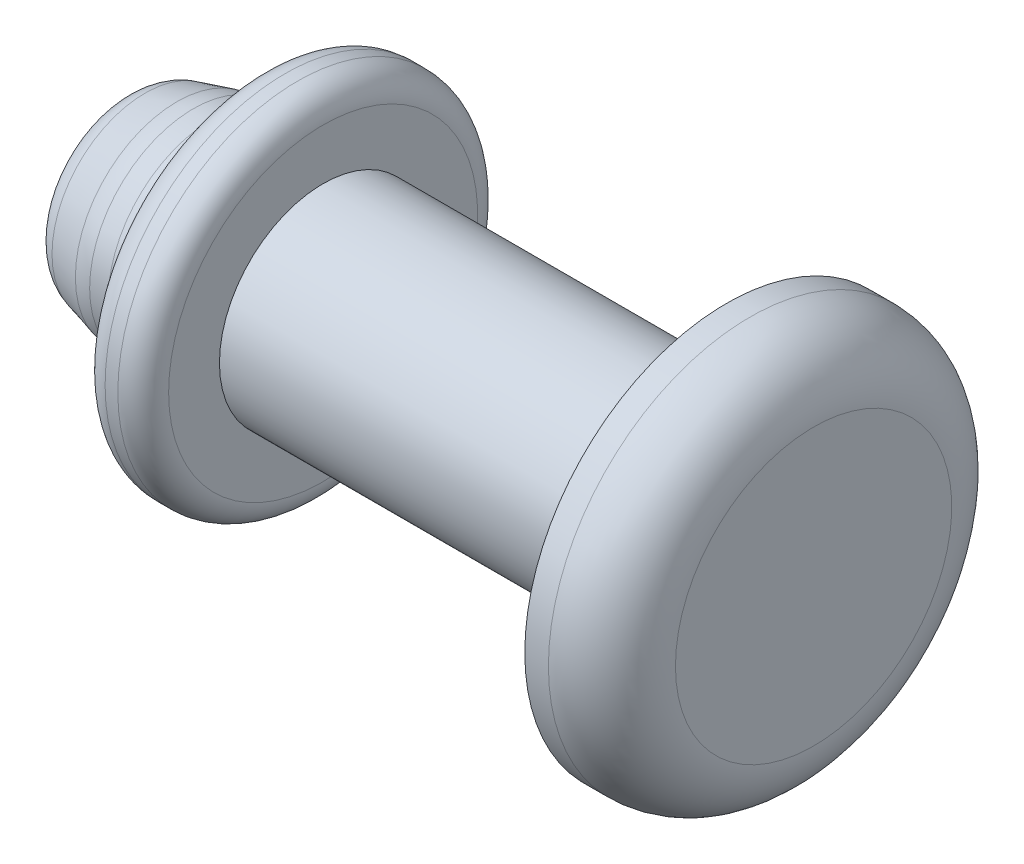
ISO-10303-21;
HEADER;
FILE_DESCRIPTION(('STEP AP214'),'2;1');
FILE_NAME('part.step','',(''),(''),'','','');
FILE_SCHEMA(('AUTOMOTIVE_DESIGN { 1 0 10303 214 1 1 1 1 }'));
ENDSEC;
DATA;
#1=APPLICATION_CONTEXT('core data for automotive mechanical design processes');
#2=APPLICATION_PROTOCOL_DEFINITION('international standard','automotive_design',2000,#1);
#3=PRODUCT_CONTEXT('',#1,'mechanical');
#4=PRODUCT('Part','Part','',(#3));
#5=PRODUCT_RELATED_PRODUCT_CATEGORY('part','',(#4));
#6=PRODUCT_DEFINITION_FORMATION('','',#4);
#7=PRODUCT_DEFINITION_CONTEXT('part definition',#1,'design');
#8=PRODUCT_DEFINITION('design','',#6,#7);
#9=PRODUCT_DEFINITION_SHAPE('','',#8);
#10=(LENGTH_UNIT() NAMED_UNIT(*) SI_UNIT(.MILLI.,.METRE.));
#11=(NAMED_UNIT(*) PLANE_ANGLE_UNIT() SI_UNIT($,.RADIAN.));
#12=(NAMED_UNIT(*) SI_UNIT($,.STERADIAN.) SOLID_ANGLE_UNIT());
#13=UNCERTAINTY_MEASURE_WITH_UNIT(LENGTH_MEASURE(1.E-05),#10,'distance_accuracy_value','');
#14=(GEOMETRIC_REPRESENTATION_CONTEXT(3) GLOBAL_UNCERTAINTY_ASSIGNED_CONTEXT((#13)) GLOBAL_UNIT_ASSIGNED_CONTEXT((#10,
#11,#12)) REPRESENTATION_CONTEXT('',''));
#15=CARTESIAN_POINT('',(0.,0.,0.));
#16=DIRECTION('',(0.,0.,1.));
#17=DIRECTION('',(1.,0.,0.));
#18=AXIS2_PLACEMENT_3D('',#15,#16,#17);
#19=CARTESIAN_POINT('',(-10.8966,0.980337313579392,0.));
#20=DIRECTION('',(1.,0.,0.));
#21=DIRECTION('',(0.,0.,-1.));
#22=AXIS2_PLACEMENT_3D('',#19,#20,#21);
#23=PLANE('',#22);
#24=CARTESIAN_POINT('',(-10.8966,0.,0.));
#25=DIRECTION('',(-1.,0.,0.));
#26=DIRECTION('',(0.,0.,1.));
#27=AXIS2_PLACEMENT_3D('',#24,#25,#26);
#28=CIRCLE('',#27,0.980337313579392);
#29=CARTESIAN_POINT('',(-10.8966,0.,0.980337313579392));
#30=VERTEX_POINT('',#29);
#31=EDGE_CURVE('E10',#30,#30,#28,.T.);
#32=ORIENTED_EDGE('',*,*,#31,.T.);
#33=EDGE_LOOP('',(#32));
#34=FACE_BOUND('',#33,.T.);
#35=ADVANCED_FACE('F40',(#34),#23,.F.);
#36=CARTESIAN_POINT('',(-10.3966,0.,0.));
#37=DIRECTION('',(-1.,0.,0.));
#38=DIRECTION('',(0.,0.,1.));
#39=AXIS2_PLACEMENT_3D('',#36,#37,#38);
#40=TOROIDAL_SURFACE('',#39,0.980337313579395,0.5);
#41=ORIENTED_EDGE('',*,*,#31,.F.);
#42=EDGE_LOOP('',(#41));
#43=FACE_BOUND('',#42,.T.);
#44=CARTESIAN_POINT('',(-10.5260095225513,0.,0.));
#45=DIRECTION('',(-1.,0.,0.));
#46=DIRECTION('',(0.,0.,1.));
#47=AXIS2_PLACEMENT_3D('',#44,#45,#46);
#48=CIRCLE('',#47,1.46330022672393);
#49=CARTESIAN_POINT('',(-10.5260095225513,0.,1.46330022672393));
#50=VERTEX_POINT('',#49);
#51=EDGE_CURVE('E46',#50,#50,#48,.T.);
#52=ORIENTED_EDGE('',*,*,#51,.T.);
#53=EDGE_LOOP('',(#52));
#54=FACE_BOUND('',#53,.T.);
#55=ADVANCED_FACE('F105',(#43,#54),#40,.T.);
#56=CARTESIAN_POINT('',(-10.0237665475151,0.,0.));
#57=DIRECTION('',(1.,0.,0.));
#58=DIRECTION('',(0.,0.,-1.));
#59=AXIS2_PLACEMENT_3D('',#56,#57,#58);
#60=CONICAL_SURFACE('',#59,1.59787582628907,0.261799387799149);
#61=ORIENTED_EDGE('',*,*,#51,.F.);
#62=EDGE_LOOP('',(#61));
#63=FACE_BOUND('',#62,.T.);
#64=CARTESIAN_POINT('',(-10.0237665475151,0.,0.));
#65=DIRECTION('',(-1.,0.,0.));
#66=DIRECTION('',(0.,0.,1.));
#67=AXIS2_PLACEMENT_3D('',#64,#65,#66);
#68=CIRCLE('',#67,1.59787582628907);
#69=CARTESIAN_POINT('',(-10.0237665475151,0.,1.59787582628907));
#70=VERTEX_POINT('',#69);
#71=EDGE_CURVE('E50',#70,#70,#68,.T.);
#72=ORIENTED_EDGE('',*,*,#71,.T.);
#73=EDGE_LOOP('',(#72));
#74=FACE_BOUND('',#73,.T.);
#75=ADVANCED_FACE('F109',(#63,#74),#60,.T.);
#76=CARTESIAN_POINT('',(-9.7649475024126,0.,0.));
#77=DIRECTION('',(-1.,0.,0.));
#78=DIRECTION('',(0.,0.,1.));
#79=AXIS2_PLACEMENT_3D('',#76,#77,#78);
#80=DEGENERATE_TOROIDAL_SURFACE('',#79,0.631949999999999,1.,.T.);
#81=ORIENTED_EDGE('',*,*,#71,.F.);
#82=EDGE_LOOP('',(#81));
#83=FACE_BOUND('',#82,.T.);
#84=CARTESIAN_POINT('',(-9.7649475024126,0.,0.));
#85=DIRECTION('',(-1.,0.,0.));
#86=DIRECTION('',(0.,0.,1.));
#87=AXIS2_PLACEMENT_3D('',#84,#85,#86);
#88=CIRCLE('',#87,1.63195);
#89=CARTESIAN_POINT('',(-9.7649475024126,0.,1.63195));
#90=VERTEX_POINT('',#89);
#91=EDGE_CURVE('E54',#90,#90,#88,.T.);
#92=ORIENTED_EDGE('',*,*,#91,.T.);
#93=EDGE_LOOP('',(#92));
#94=FACE_BOUND('',#93,.T.);
#95=ADVANCED_FACE('F114',(#83,#94),#80,.T.);
#96=CARTESIAN_POINT('',(-42.3000178816333,0.,0.));
#97=DIRECTION('',(-1.,0.,0.));
#98=DIRECTION('',(0.,0.,1.));
#99=AXIS2_PLACEMENT_3D('',#96,#97,#98);
#100=CYLINDRICAL_SURFACE('',#99,1.63195);
#101=ORIENTED_EDGE('',*,*,#91,.F.);
#102=EDGE_LOOP('',(#101));
#103=FACE_BOUND('',#102,.T.);
#104=CARTESIAN_POINT('',(-9.47160000000001,0.,0.));
#105=DIRECTION('',(-1.,0.,0.));
#106=DIRECTION('',(0.,0.,1.));
#107=AXIS2_PLACEMENT_3D('',#104,#105,#106);
#108=CIRCLE('',#107,1.63195);
#109=CARTESIAN_POINT('',(-9.47160000000001,0.,1.63195));
#110=VERTEX_POINT('',#109);
#111=EDGE_CURVE('E59',#110,#110,#108,.T.);
#112=ORIENTED_EDGE('',*,*,#111,.T.);
#113=EDGE_LOOP('',(#112));
#114=FACE_BOUND('',#113,.T.);
#115=ADVANCED_FACE('F120',(#103,#114),#100,.T.);
#116=CARTESIAN_POINT('',(-9.4716,0.,0.));
#117=DIRECTION('',(-1.,0.,0.));
#118=DIRECTION('',(0.,0.,1.));
#119=AXIS2_PLACEMENT_3D('',#116,#117,#118);
#120=TOROIDAL_SURFACE('',#119,2.38195,0.75);
#121=ORIENTED_EDGE('',*,*,#111,.F.);
#122=EDGE_LOOP('',(#121));
#123=FACE_BOUND('',#122,.T.);
#124=CARTESIAN_POINT('',(-8.7216,0.,0.));
#125=DIRECTION('',(-1.,0.,0.));
#126=DIRECTION('',(0.,0.,1.));
#127=AXIS2_PLACEMENT_3D('',#124,#125,#126);
#128=CIRCLE('',#127,2.38195);
#129=CARTESIAN_POINT('',(-8.7216,0.,2.38195));
#130=VERTEX_POINT('',#129);
#131=EDGE_CURVE('E62',#130,#130,#128,.T.);
#132=ORIENTED_EDGE('',*,*,#131,.T.);
#133=EDGE_LOOP('',(#132));
#134=FACE_BOUND('',#133,.T.);
#135=ADVANCED_FACE('F124',(#123,#134),#120,.F.);
#136=CARTESIAN_POINT('',(-8.7216,2.43195,0.));
#137=DIRECTION('',(1.,0.,0.));
#138=DIRECTION('',(0.,0.,-1.));
#139=AXIS2_PLACEMENT_3D('',#136,#137,#138);
#140=PLANE('',#139);
#141=ORIENTED_EDGE('',*,*,#131,.F.);
#142=EDGE_LOOP('',(#141));
#143=FACE_BOUND('',#142,.T.);
#144=CARTESIAN_POINT('',(-8.7216,0.,0.));
#145=DIRECTION('',(-1.,0.,0.));
#146=DIRECTION('',(0.,0.,1.));
#147=AXIS2_PLACEMENT_3D('',#144,#145,#146);
#148=CIRCLE('',#147,2.43195);
#149=CARTESIAN_POINT('',(-8.7216,0.,2.43195));
#150=VERTEX_POINT('',#149);
#151=EDGE_CURVE('E65',#150,#150,#148,.T.);
#152=ORIENTED_EDGE('',*,*,#151,.T.);
#153=EDGE_LOOP('',(#152));
#154=FACE_BOUND('',#153,.T.);
#155=ADVANCED_FACE('F128',(#143,#154),#140,.F.);
#156=CARTESIAN_POINT('',(-8.3216,0.,0.));
#157=DIRECTION('',(-1.,0.,0.));
#158=DIRECTION('',(0.,0.,1.));
#159=AXIS2_PLACEMENT_3D('',#156,#157,#158);
#160=TOROIDAL_SURFACE('',#159,2.43195,0.4);
#161=ORIENTED_EDGE('',*,*,#151,.F.);
#162=EDGE_LOOP('',(#161));
#163=FACE_BOUND('',#162,.T.);
#164=CARTESIAN_POINT('',(-8.3216,0.,0.));
#165=DIRECTION('',(-1.,0.,0.));
#166=DIRECTION('',(0.,0.,1.));
#167=AXIS2_PLACEMENT_3D('',#164,#165,#166);
#168=CIRCLE('',#167,2.83195);
#169=CARTESIAN_POINT('',(-8.3216,0.,2.83195));
#170=VERTEX_POINT('',#169);
#171=EDGE_CURVE('E68',#170,#170,#168,.T.);
#172=ORIENTED_EDGE('',*,*,#171,.T.);
#173=EDGE_LOOP('',(#172));
#174=FACE_BOUND('',#173,.T.);
#175=ADVANCED_FACE('F132',(#163,#174),#160,.T.);
#176=CARTESIAN_POINT('',(-42.3000178816333,0.,0.));
#177=DIRECTION('',(-1.,0.,0.));
#178=DIRECTION('',(0.,0.,1.));
#179=AXIS2_PLACEMENT_3D('',#176,#177,#178);
#180=CYLINDRICAL_SURFACE('',#179,2.83195);
#181=ORIENTED_EDGE('',*,*,#171,.F.);
#182=EDGE_LOOP('',(#181));
#183=FACE_BOUND('',#182,.T.);
#184=CARTESIAN_POINT('',(-8.1216,0.,0.));
#185=DIRECTION('',(-1.,0.,0.));
#186=DIRECTION('',(0.,0.,1.));
#187=AXIS2_PLACEMENT_3D('',#184,#185,#186);
#188=CIRCLE('',#187,2.83195);
#189=CARTESIAN_POINT('',(-8.1216,0.,2.83195));
#190=VERTEX_POINT('',#189);
#191=EDGE_CURVE('E71',#190,#190,#188,.T.);
#192=ORIENTED_EDGE('',*,*,#191,.T.);
#193=EDGE_LOOP('',(#192));
#194=FACE_BOUND('',#193,.T.);
#195=ADVANCED_FACE('F136',(#183,#194),#180,.T.);
#196=CARTESIAN_POINT('',(-8.1216,0.,0.));
#197=DIRECTION('',(-1.,0.,0.));
#198=DIRECTION('',(0.,0.,1.));
#199=AXIS2_PLACEMENT_3D('',#196,#197,#198);
#200=TOROIDAL_SURFACE('',#199,2.43195,0.400000000000001);
#201=ORIENTED_EDGE('',*,*,#191,.F.);
#202=EDGE_LOOP('',(#201));
#203=FACE_BOUND('',#202,.T.);
#204=CARTESIAN_POINT('',(-7.7216,0.,0.));
#205=DIRECTION('',(-1.,0.,0.));
#206=DIRECTION('',(0.,0.,1.));
#207=AXIS2_PLACEMENT_3D('',#204,#205,#206);
#208=CIRCLE('',#207,2.43195);
#209=CARTESIAN_POINT('',(-7.7216,0.,2.43195));
#210=VERTEX_POINT('',#209);
#211=EDGE_CURVE('E74',#210,#210,#208,.T.);
#212=ORIENTED_EDGE('',*,*,#211,.T.);
#213=EDGE_LOOP('',(#212));
#214=FACE_BOUND('',#213,.T.);
#215=ADVANCED_FACE('F140',(#203,#214),#200,.T.);
#216=CARTESIAN_POINT('',(-7.7216,1.63195,0.));
#217=DIRECTION('',(-1.,0.,0.));
#218=DIRECTION('',(0.,0.,1.));
#219=AXIS2_PLACEMENT_3D('',#216,#217,#218);
#220=PLANE('',#219);
#221=ORIENTED_EDGE('',*,*,#211,.F.);
#222=EDGE_LOOP('',(#221));
#223=FACE_BOUND('',#222,.T.);
#224=CARTESIAN_POINT('',(-7.7216,0.,0.));
#225=DIRECTION('',(-1.,0.,0.));
#226=DIRECTION('',(0.,0.,1.));
#227=AXIS2_PLACEMENT_3D('',#224,#225,#226);
#228=CIRCLE('',#227,1.63195);
#229=CARTESIAN_POINT('',(-7.7216,0.,1.63195));
#230=VERTEX_POINT('',#229);
#231=EDGE_CURVE('E77',#230,#230,#228,.T.);
#232=ORIENTED_EDGE('',*,*,#231,.T.);
#233=EDGE_LOOP('',(#232));
#234=FACE_BOUND('',#233,.T.);
#235=ADVANCED_FACE('F144',(#223,#234),#220,.F.);
#236=CARTESIAN_POINT('',(-42.3000178816333,0.,0.));
#237=DIRECTION('',(-1.,0.,0.));
#238=DIRECTION('',(0.,0.,1.));
#239=AXIS2_PLACEMENT_3D('',#236,#237,#238);
#240=CYLINDRICAL_SURFACE('',#239,1.63195);
#241=ORIENTED_EDGE('',*,*,#231,.F.);
#242=EDGE_LOOP('',(#241));
#243=FACE_BOUND('',#242,.T.);
#244=CARTESIAN_POINT('',(-1.3716,0.,0.));
#245=DIRECTION('',(-1.,0.,0.));
#246=DIRECTION('',(0.,0.,1.));
#247=AXIS2_PLACEMENT_3D('',#244,#245,#246);
#248=CIRCLE('',#247,1.63195);
#249=CARTESIAN_POINT('',(-1.3716,0.,1.63195));
#250=VERTEX_POINT('',#249);
#251=EDGE_CURVE('E80',#250,#250,#248,.T.);
#252=ORIENTED_EDGE('',*,*,#251,.T.);
#253=EDGE_LOOP('',(#252));
#254=FACE_BOUND('',#253,.T.);
#255=ADVANCED_FACE('F148',(#243,#254),#240,.T.);
#256=CARTESIAN_POINT('',(-1.3716,3.175,0.));
#257=DIRECTION('',(1.,0.,0.));
#258=DIRECTION('',(0.,0.,-1.));
#259=AXIS2_PLACEMENT_3D('',#256,#257,#258);
#260=PLANE('',#259);
#261=ORIENTED_EDGE('',*,*,#251,.F.);
#262=EDGE_LOOP('',(#261));
#263=FACE_BOUND('',#262,.T.);
#264=CARTESIAN_POINT('',(-1.3716,0.,0.));
#265=DIRECTION('',(-1.,0.,0.));
#266=DIRECTION('',(0.,0.,1.));
#267=AXIS2_PLACEMENT_3D('',#264,#265,#266);
#268=CIRCLE('',#267,3.175);
#269=CARTESIAN_POINT('',(-1.3716,0.,3.175));
#270=VERTEX_POINT('',#269);
#271=EDGE_CURVE('E83',#270,#270,#268,.T.);
#272=ORIENTED_EDGE('',*,*,#271,.T.);
#273=EDGE_LOOP('',(#272));
#274=FACE_BOUND('',#273,.T.);
#275=ADVANCED_FACE('F152',(#263,#274),#260,.F.);
#276=CARTESIAN_POINT('',(-42.3000178816333,0.,0.));
#277=DIRECTION('',(-1.,0.,0.));
#278=DIRECTION('',(0.,0.,1.));
#279=AXIS2_PLACEMENT_3D('',#276,#277,#278);
#280=CYLINDRICAL_SURFACE('',#279,3.175);
#281=ORIENTED_EDGE('',*,*,#271,.F.);
#282=EDGE_LOOP('',(#281));
#283=FACE_BOUND('',#282,.T.);
#284=CARTESIAN_POINT('',(-1.,0.,0.));
#285=DIRECTION('',(-1.,0.,0.));
#286=DIRECTION('',(0.,0.,1.));
#287=AXIS2_PLACEMENT_3D('',#284,#285,#286);
#288=CIRCLE('',#287,3.175);
#289=CARTESIAN_POINT('',(-1.,0.,3.175));
#290=VERTEX_POINT('',#289);
#291=EDGE_CURVE('E86',#290,#290,#288,.T.);
#292=ORIENTED_EDGE('',*,*,#291,.T.);
#293=EDGE_LOOP('',(#292));
#294=FACE_BOUND('',#293,.T.);
#295=ADVANCED_FACE('F101',(#283,#294),#280,.T.);
#296=CARTESIAN_POINT('',(-1.,0.,0.));
#297=DIRECTION('',(-1.,0.,0.));
#298=DIRECTION('',(0.,0.,1.));
#299=AXIS2_PLACEMENT_3D('',#296,#297,#298);
#300=TOROIDAL_SURFACE('',#299,2.175,1.);
#301=ORIENTED_EDGE('',*,*,#291,.F.);
#302=EDGE_LOOP('',(#301));
#303=FACE_BOUND('',#302,.T.);
#304=CARTESIAN_POINT('',(0.,0.,0.));
#305=DIRECTION('',(-1.,0.,0.));
#306=DIRECTION('',(0.,0.,1.));
#307=AXIS2_PLACEMENT_3D('',#304,#305,#306);
#308=CIRCLE('',#307,2.175);
#309=CARTESIAN_POINT('',(0.,0.,2.175));
#310=VERTEX_POINT('',#309);
#311=EDGE_CURVE('E89',#310,#310,#308,.T.);
#312=ORIENTED_EDGE('',*,*,#311,.T.);
#313=EDGE_LOOP('',(#312));
#314=FACE_BOUND('',#313,.T.);
#315=ADVANCED_FACE('F93',(#303,#314),#300,.T.);
#316=CARTESIAN_POINT('',(0.,0.,0.));
#317=DIRECTION('',(-1.,0.,0.));
#318=DIRECTION('',(0.,0.,1.));
#319=AXIS2_PLACEMENT_3D('',#316,#317,#318);
#320=PLANE('',#319);
#321=ORIENTED_EDGE('',*,*,#311,.F.);
#322=EDGE_LOOP('',(#321));
#323=FACE_BOUND('',#322,.T.);
#324=ADVANCED_FACE('F95',(#323),#320,.F.);
#325=CLOSED_SHELL('',(#35,#55,#75,#95,#115,#135,#155,#175,#195,#215,#235,#255,#275,#295,#315,#324));
#326=MANIFOLD_SOLID_BREP('B2',#325);
#327=ADVANCED_BREP_SHAPE_REPRESENTATION('',(#18,#326),#14);
#328=SHAPE_DEFINITION_REPRESENTATION(#9,#327);
ENDSEC;
END-ISO-10303-21;
